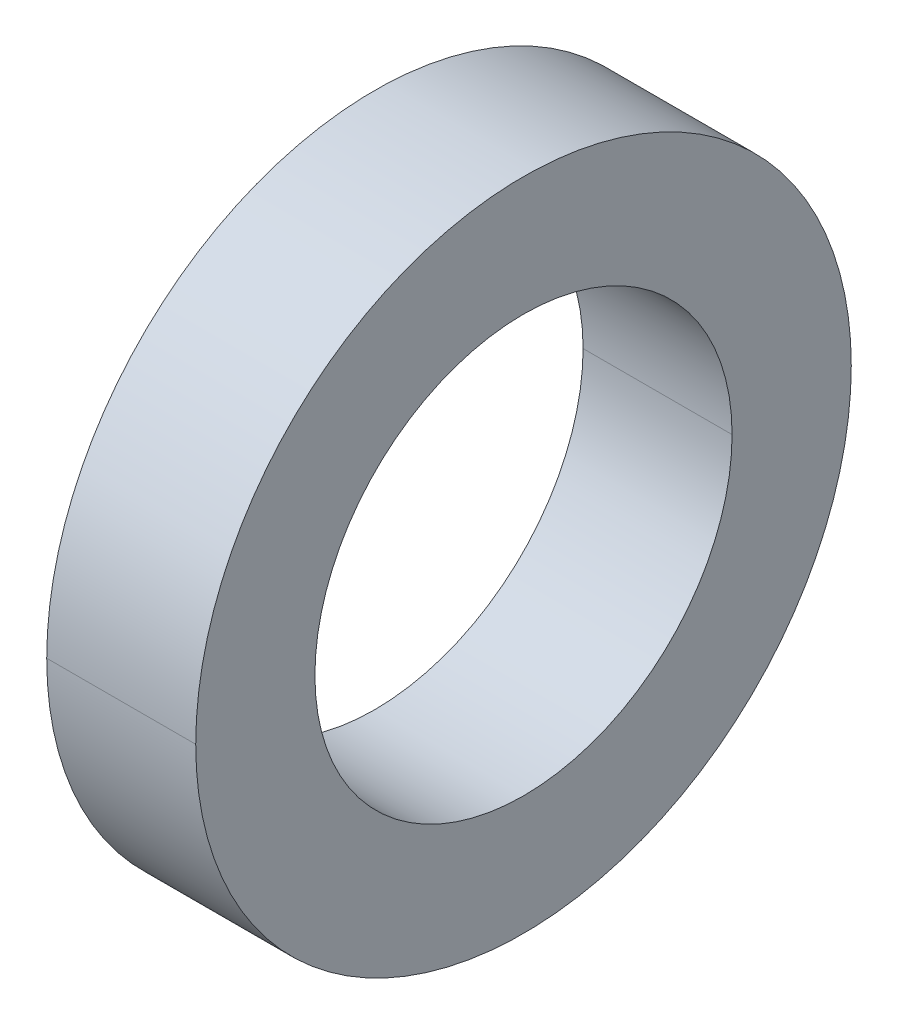
ISO-10303-21;
HEADER;
FILE_DESCRIPTION(('STEP AP214'),'2;1');
FILE_NAME('part.step','',(''),(''),'','','');
FILE_SCHEMA(('AUTOMOTIVE_DESIGN { 1 0 10303 214 1 1 1 1 }'));
ENDSEC;
DATA;
#1=APPLICATION_CONTEXT('core data for automotive mechanical design processes');
#2=APPLICATION_PROTOCOL_DEFINITION('international standard','automotive_design',2000,#1);
#3=PRODUCT_CONTEXT('',#1,'mechanical');
#4=PRODUCT('Part','Part','',(#3));
#5=PRODUCT_RELATED_PRODUCT_CATEGORY('part','',(#4));
#6=PRODUCT_DEFINITION_FORMATION('','',#4);
#7=PRODUCT_DEFINITION_CONTEXT('part definition',#1,'design');
#8=PRODUCT_DEFINITION('design','',#6,#7);
#9=PRODUCT_DEFINITION_SHAPE('','',#8);
#10=(LENGTH_UNIT() NAMED_UNIT(*) SI_UNIT(.MILLI.,.METRE.));
#11=(NAMED_UNIT(*) PLANE_ANGLE_UNIT() SI_UNIT($,.RADIAN.));
#12=(NAMED_UNIT(*) SI_UNIT($,.STERADIAN.) SOLID_ANGLE_UNIT());
#13=UNCERTAINTY_MEASURE_WITH_UNIT(LENGTH_MEASURE(1.E-05),#10,'distance_accuracy_value','');
#14=(GEOMETRIC_REPRESENTATION_CONTEXT(3) GLOBAL_UNCERTAINTY_ASSIGNED_CONTEXT((#13)) GLOBAL_UNIT_ASSIGNED_CONTEXT((#10,
#11,#12)) REPRESENTATION_CONTEXT('',''));
#15=CARTESIAN_POINT('',(0.,0.,0.));
#16=DIRECTION('',(0.,0.,1.));
#17=DIRECTION('',(1.,0.,0.));
#18=AXIS2_PLACEMENT_3D('',#15,#16,#17);
#19=CARTESIAN_POINT('',(0.,0.,0.));
#20=DIRECTION('',(-1.,0.,0.));
#21=DIRECTION('',(0.,0.,1.));
#22=AXIS2_PLACEMENT_3D('',#19,#20,#21);
#23=CYLINDRICAL_SURFACE('',#22,11.);
#24=DIRECTION('',(-1.,0.,0.));
#25=VECTOR('',#24,1.);
#26=CARTESIAN_POINT('',(0.,0.,-11.));
#27=LINE('',#26,#25);
#28=CARTESIAN_POINT('',(32.5,0.,-11.));
#29=VERTEX_POINT('',#28);
#30=CARTESIAN_POINT('',(27.5,0.,-11.));
#31=VERTEX_POINT('',#30);
#32=EDGE_CURVE('E83',#29,#31,#27,.T.);
#33=ORIENTED_EDGE('',*,*,#32,.F.);
#34=CARTESIAN_POINT('',(32.5,0.,0.));
#35=DIRECTION('',(-1.,0.,0.));
#36=DIRECTION('',(0.,0.,1.));
#37=AXIS2_PLACEMENT_3D('',#34,#35,#36);
#38=CIRCLE('',#37,11.);
#39=CARTESIAN_POINT('',(32.5,0.,11.));
#40=VERTEX_POINT('',#39);
#41=EDGE_CURVE('E74',#29,#40,#38,.T.);
#42=ORIENTED_EDGE('',*,*,#41,.T.);
#43=DIRECTION('',(-1.,0.,0.));
#44=VECTOR('',#43,1.);
#45=CARTESIAN_POINT('',(0.,0.,11.));
#46=LINE('',#45,#44);
#47=CARTESIAN_POINT('',(27.5,0.,11.));
#48=VERTEX_POINT('',#47);
#49=EDGE_CURVE('E90',#40,#48,#46,.T.);
#50=ORIENTED_EDGE('',*,*,#49,.T.);
#51=CARTESIAN_POINT('',(27.5,0.,0.));
#52=DIRECTION('',(-1.,0.,0.));
#53=DIRECTION('',(0.,0.,1.));
#54=AXIS2_PLACEMENT_3D('',#51,#52,#53);
#55=CIRCLE('',#54,11.);
#56=EDGE_CURVE('E11',#31,#48,#55,.T.);
#57=ORIENTED_EDGE('',*,*,#56,.F.);
#58=EDGE_LOOP('',(#33,#42,#50,#57));
#59=FACE_BOUND('',#58,.T.);
#60=ADVANCED_FACE('F16',(#59),#23,.T.);
#61=CARTESIAN_POINT('',(27.5,11.,0.));
#62=DIRECTION('',(1.,0.,0.));
#63=DIRECTION('',(0.,1.,0.));
#64=AXIS2_PLACEMENT_3D('',#61,#62,#63);
#65=PLANE('',#64);
#66=CARTESIAN_POINT('',(27.5,0.,0.));
#67=DIRECTION('',(-1.,0.,0.));
#68=DIRECTION('',(0.,0.,1.));
#69=AXIS2_PLACEMENT_3D('',#66,#67,#68);
#70=CIRCLE('',#69,7.);
#71=CARTESIAN_POINT('',(27.5,0.,7.));
#72=VERTEX_POINT('',#71);
#73=CARTESIAN_POINT('',(27.5,0.,-7.));
#74=VERTEX_POINT('',#73);
#75=EDGE_CURVE('E27',#72,#74,#70,.T.);
#76=ORIENTED_EDGE('',*,*,#75,.F.);
#77=CARTESIAN_POINT('',(27.5,0.,0.));
#78=DIRECTION('',(-1.,0.,0.));
#79=DIRECTION('',(0.,0.,1.));
#80=AXIS2_PLACEMENT_3D('',#77,#78,#79);
#81=CIRCLE('',#80,7.);
#82=EDGE_CURVE('E100',#74,#72,#81,.T.);
#83=ORIENTED_EDGE('',*,*,#82,.F.);
#84=EDGE_LOOP('',(#76,#83));
#85=FACE_BOUND('',#84,.T.);
#86=CARTESIAN_POINT('',(27.5,0.,0.));
#87=DIRECTION('',(-1.,0.,0.));
#88=DIRECTION('',(0.,0.,1.));
#89=AXIS2_PLACEMENT_3D('',#86,#87,#88);
#90=CIRCLE('',#89,11.);
#91=EDGE_CURVE('E87',#48,#31,#90,.T.);
#92=ORIENTED_EDGE('',*,*,#91,.T.);
#93=ORIENTED_EDGE('',*,*,#56,.T.);
#94=EDGE_LOOP('',(#92,#93));
#95=FACE_BOUND('',#94,.T.);
#96=ADVANCED_FACE('F123',(#85,#95),#65,.F.);
#97=CARTESIAN_POINT('',(0.,0.,0.));
#98=DIRECTION('',(-1.,0.,0.));
#99=DIRECTION('',(0.,0.,1.));
#100=AXIS2_PLACEMENT_3D('',#97,#98,#99);
#101=CYLINDRICAL_SURFACE('',#100,7.);
#102=DIRECTION('',(-1.,0.,0.));
#103=VECTOR('',#102,1.);
#104=CARTESIAN_POINT('',(0.,0.,-7.));
#105=LINE('',#104,#103);
#106=CARTESIAN_POINT('',(32.5,0.,-7.));
#107=VERTEX_POINT('',#106);
#108=EDGE_CURVE('E97',#107,#74,#105,.T.);
#109=ORIENTED_EDGE('',*,*,#108,.F.);
#110=CARTESIAN_POINT('',(32.5,0.,0.));
#111=DIRECTION('',(-1.,0.,0.));
#112=DIRECTION('',(0.,0.,1.));
#113=AXIS2_PLACEMENT_3D('',#110,#111,#112);
#114=CIRCLE('',#113,7.);
#115=CARTESIAN_POINT('',(32.5,0.,7.));
#116=VERTEX_POINT('',#115);
#117=EDGE_CURVE('E20',#116,#107,#114,.T.);
#118=ORIENTED_EDGE('',*,*,#117,.F.);
#119=DIRECTION('',(-1.,0.,0.));
#120=VECTOR('',#119,1.);
#121=CARTESIAN_POINT('',(0.,0.,7.));
#122=LINE('',#121,#120);
#123=EDGE_CURVE('E80',#116,#72,#122,.T.);
#124=ORIENTED_EDGE('',*,*,#123,.T.);
#125=ORIENTED_EDGE('',*,*,#75,.T.);
#126=EDGE_LOOP('',(#109,#118,#124,#125));
#127=FACE_BOUND('',#126,.T.);
#128=ADVANCED_FACE('F120',(#127),#101,.F.);
#129=CARTESIAN_POINT('',(32.5,11.,0.));
#130=DIRECTION('',(-1.,0.,0.));
#131=DIRECTION('',(0.,0.,1.));
#132=AXIS2_PLACEMENT_3D('',#129,#130,#131);
#133=PLANE('',#132);
#134=ORIENTED_EDGE('',*,*,#117,.T.);
#135=CARTESIAN_POINT('',(32.5,0.,0.));
#136=DIRECTION('',(-1.,0.,0.));
#137=DIRECTION('',(0.,0.,1.));
#138=AXIS2_PLACEMENT_3D('',#135,#136,#137);
#139=CIRCLE('',#138,7.);
#140=EDGE_CURVE('E101',#107,#116,#139,.T.);
#141=ORIENTED_EDGE('',*,*,#140,.T.);
#142=EDGE_LOOP('',(#134,#141));
#143=FACE_BOUND('',#142,.T.);
#144=CARTESIAN_POINT('',(32.5,0.,0.));
#145=DIRECTION('',(-1.,0.,0.));
#146=DIRECTION('',(0.,0.,1.));
#147=AXIS2_PLACEMENT_3D('',#144,#145,#146);
#148=CIRCLE('',#147,11.);
#149=EDGE_CURVE('E77',#40,#29,#148,.T.);
#150=ORIENTED_EDGE('',*,*,#149,.F.);
#151=ORIENTED_EDGE('',*,*,#41,.F.);
#152=EDGE_LOOP('',(#150,#151));
#153=FACE_BOUND('',#152,.T.);
#154=ADVANCED_FACE('F75',(#143,#153),#133,.F.);
#155=CARTESIAN_POINT('',(0.,0.,0.));
#156=DIRECTION('',(-1.,0.,0.));
#157=DIRECTION('',(0.,0.,1.));
#158=AXIS2_PLACEMENT_3D('',#155,#156,#157);
#159=CYLINDRICAL_SURFACE('',#158,7.);
#160=ORIENTED_EDGE('',*,*,#140,.F.);
#161=ORIENTED_EDGE('',*,*,#108,.T.);
#162=ORIENTED_EDGE('',*,*,#82,.T.);
#163=ORIENTED_EDGE('',*,*,#123,.F.);
#164=EDGE_LOOP('',(#160,#161,#162,#163));
#165=FACE_BOUND('',#164,.T.);
#166=ADVANCED_FACE('F18',(#165),#159,.F.);
#167=CARTESIAN_POINT('',(0.,0.,0.));
#168=DIRECTION('',(-1.,0.,0.));
#169=DIRECTION('',(0.,0.,1.));
#170=AXIS2_PLACEMENT_3D('',#167,#168,#169);
#171=CYLINDRICAL_SURFACE('',#170,11.);
#172=ORIENTED_EDGE('',*,*,#149,.T.);
#173=ORIENTED_EDGE('',*,*,#32,.T.);
#174=ORIENTED_EDGE('',*,*,#91,.F.);
#175=ORIENTED_EDGE('',*,*,#49,.F.);
#176=EDGE_LOOP('',(#172,#173,#174,#175));
#177=FACE_BOUND('',#176,.T.);
#178=ADVANCED_FACE('F89',(#177),#171,.T.);
#179=CLOSED_SHELL('',(#60,#96,#128,#154,#166,#178));
#180=MANIFOLD_SOLID_BREP('B1',#179);
#181=ADVANCED_BREP_SHAPE_REPRESENTATION('',(#18,#180),#14);
#182=SHAPE_DEFINITION_REPRESENTATION(#9,#181);
ENDSEC;
END-ISO-10303-21;
